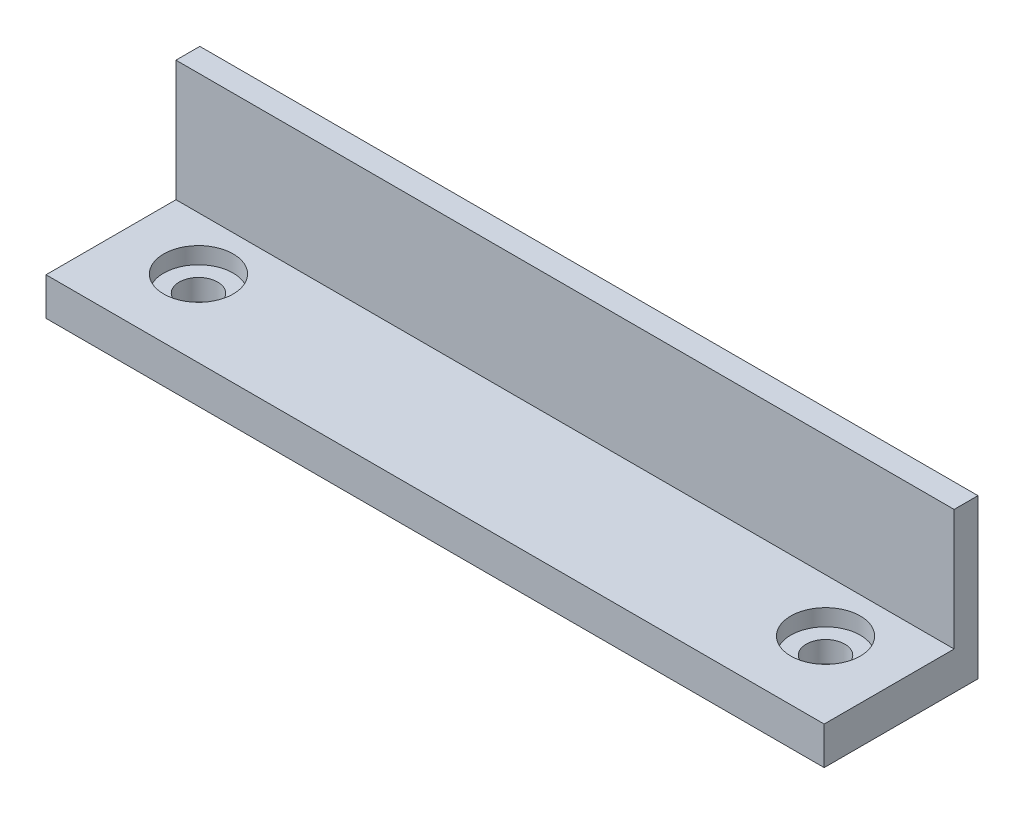
ISO-10303-21;
HEADER;
FILE_DESCRIPTION(('STEP AP214'),'2;1');
FILE_NAME('part.step','',(''),(''),'','','');
FILE_SCHEMA(('AUTOMOTIVE_DESIGN { 1 0 10303 214 1 1 1 1 }'));
ENDSEC;
DATA;
#1=APPLICATION_CONTEXT('core data for automotive mechanical design processes');
#2=APPLICATION_PROTOCOL_DEFINITION('international standard','automotive_design',2000,#1);
#3=PRODUCT_CONTEXT('',#1,'mechanical');
#4=PRODUCT('Part','Part','',(#3));
#5=PRODUCT_RELATED_PRODUCT_CATEGORY('part','',(#4));
#6=PRODUCT_DEFINITION_FORMATION('','',#4);
#7=PRODUCT_DEFINITION_CONTEXT('part definition',#1,'design');
#8=PRODUCT_DEFINITION('design','',#6,#7);
#9=PRODUCT_DEFINITION_SHAPE('','',#8);
#10=(LENGTH_UNIT() NAMED_UNIT(*) SI_UNIT(.MILLI.,.METRE.));
#11=(NAMED_UNIT(*) PLANE_ANGLE_UNIT() SI_UNIT($,.RADIAN.));
#12=(NAMED_UNIT(*) SI_UNIT($,.STERADIAN.) SOLID_ANGLE_UNIT());
#13=UNCERTAINTY_MEASURE_WITH_UNIT(LENGTH_MEASURE(1.E-05),#10,'distance_accuracy_value','');
#14=(GEOMETRIC_REPRESENTATION_CONTEXT(3) GLOBAL_UNCERTAINTY_ASSIGNED_CONTEXT((#13)) GLOBAL_UNIT_ASSIGNED_CONTEXT((#10,
#11,#12)) REPRESENTATION_CONTEXT('',''));
#15=CARTESIAN_POINT('',(0.,0.,0.));
#16=DIRECTION('',(0.,0.,1.));
#17=DIRECTION('',(1.,0.,0.));
#18=AXIS2_PLACEMENT_3D('',#15,#16,#17);
#19=CARTESIAN_POINT('',(-41.5,5.,0.));
#20=DIRECTION('',(0.,-1.,0.));
#21=DIRECTION('',(0.,0.,-1.));
#22=AXIS2_PLACEMENT_3D('',#19,#20,#21);
#23=CYLINDRICAL_SURFACE('',#22,2.55);
#24=CARTESIAN_POINT('',(-41.5,0.,0.));
#25=DIRECTION('',(0.,1.,0.));
#26=DIRECTION('',(0.,0.,1.));
#27=AXIS2_PLACEMENT_3D('',#24,#25,#26);
#28=CIRCLE('',#27,2.55);
#29=CARTESIAN_POINT('',(-41.5,0.,2.55));
#30=VERTEX_POINT('',#29);
#31=EDGE_CURVE('E118',#30,#30,#28,.F.);
#32=ORIENTED_EDGE('',*,*,#31,.T.);
#33=EDGE_LOOP('',(#32));
#34=FACE_BOUND('',#33,.T.);
#35=CARTESIAN_POINT('',(-41.5,2.8,0.));
#36=DIRECTION('',(0.,1.,0.));
#37=DIRECTION('',(0.,0.,1.));
#38=AXIS2_PLACEMENT_3D('',#35,#36,#37);
#39=CIRCLE('',#38,2.55);
#40=CARTESIAN_POINT('',(-41.5,2.8,2.55));
#41=VERTEX_POINT('',#40);
#42=EDGE_CURVE('E168',#41,#41,#39,.T.);
#43=ORIENTED_EDGE('',*,*,#42,.T.);
#44=EDGE_LOOP('',(#43));
#45=FACE_BOUND('',#44,.T.);
#46=ADVANCED_FACE('F54',(#34,#45),#23,.F.);
#47=CARTESIAN_POINT('',(41.5,5.,0.));
#48=DIRECTION('',(0.,-1.,0.));
#49=DIRECTION('',(0.,0.,-1.));
#50=AXIS2_PLACEMENT_3D('',#47,#48,#49);
#51=CYLINDRICAL_SURFACE('',#50,2.55);
#52=CARTESIAN_POINT('',(41.5,0.,0.));
#53=DIRECTION('',(0.,1.,0.));
#54=DIRECTION('',(0.,0.,1.));
#55=AXIS2_PLACEMENT_3D('',#52,#53,#54);
#56=CIRCLE('',#55,2.55);
#57=CARTESIAN_POINT('',(41.5,0.,2.55));
#58=VERTEX_POINT('',#57);
#59=EDGE_CURVE('E122',#58,#58,#56,.T.);
#60=ORIENTED_EDGE('',*,*,#59,.F.);
#61=EDGE_LOOP('',(#60));
#62=FACE_BOUND('',#61,.T.);
#63=CARTESIAN_POINT('',(41.5,2.8,0.));
#64=DIRECTION('',(0.,1.,0.));
#65=DIRECTION('',(0.,0.,1.));
#66=AXIS2_PLACEMENT_3D('',#63,#64,#65);
#67=CIRCLE('',#66,2.55);
#68=CARTESIAN_POINT('',(41.5,2.8,2.55));
#69=VERTEX_POINT('',#68);
#70=EDGE_CURVE('E165',#69,#69,#67,.T.);
#71=ORIENTED_EDGE('',*,*,#70,.T.);
#72=EDGE_LOOP('',(#71));
#73=FACE_BOUND('',#72,.T.);
#74=ADVANCED_FACE('F196',(#62,#73),#51,.F.);
#75=CARTESIAN_POINT('',(0.,5.,0.));
#76=DIRECTION('',(0.,1.,0.));
#77=DIRECTION('',(0.,0.,1.));
#78=AXIS2_PLACEMENT_3D('',#75,#76,#77);
#79=PLANE('',#78);
#80=CARTESIAN_POINT('',(-41.5,5.,0.));
#81=DIRECTION('',(0.,1.,0.));
#82=DIRECTION('',(0.,0.,1.));
#83=AXIS2_PLACEMENT_3D('',#80,#81,#82);
#84=CIRCLE('',#83,4.6);
#85=CARTESIAN_POINT('',(-41.5,5.,4.6));
#86=VERTEX_POINT('',#85);
#87=EDGE_CURVE('E171',#86,#86,#84,.T.);
#88=ORIENTED_EDGE('',*,*,#87,.F.);
#89=EDGE_LOOP('',(#88));
#90=FACE_BOUND('',#89,.T.);
#91=CARTESIAN_POINT('',(41.5,5.,0.));
#92=DIRECTION('',(0.,1.,0.));
#93=DIRECTION('',(0.,0.,1.));
#94=AXIS2_PLACEMENT_3D('',#91,#92,#93);
#95=CIRCLE('',#94,4.6);
#96=CARTESIAN_POINT('',(41.5,5.,4.6));
#97=VERTEX_POINT('',#96);
#98=EDGE_CURVE('E161',#97,#97,#95,.T.);
#99=ORIENTED_EDGE('',*,*,#98,.F.);
#100=EDGE_LOOP('',(#99));
#101=FACE_BOUND('',#100,.T.);
#102=DIRECTION('',(0.,0.,-1.));
#103=VECTOR('',#102,1.);
#104=CARTESIAN_POINT('',(51.5,5.,0.));
#105=LINE('',#104,#103);
#106=CARTESIAN_POINT('',(51.5,5.,10.18));
#107=VERTEX_POINT('',#106);
#108=CARTESIAN_POINT('',(51.5,5.,-7.02));
#109=VERTEX_POINT('',#108);
#110=EDGE_CURVE('E142',#107,#109,#105,.T.);
#111=ORIENTED_EDGE('',*,*,#110,.T.);
#112=DIRECTION('',(-1.,0.,0.));
#113=VECTOR('',#112,1.);
#114=CARTESIAN_POINT('',(0.,5.,-7.02));
#115=LINE('',#114,#113);
#116=CARTESIAN_POINT('',(-51.5,5.,-7.02));
#117=VERTEX_POINT('',#116);
#118=EDGE_CURVE('E150',#109,#117,#115,.T.);
#119=ORIENTED_EDGE('',*,*,#118,.T.);
#120=DIRECTION('',(0.,0.,-1.));
#121=VECTOR('',#120,1.);
#122=CARTESIAN_POINT('',(-51.5,5.,0.));
#123=LINE('',#122,#121);
#124=CARTESIAN_POINT('',(-51.5,5.,10.18));
#125=VERTEX_POINT('',#124);
#126=EDGE_CURVE('E103',#125,#117,#123,.T.);
#127=ORIENTED_EDGE('',*,*,#126,.F.);
#128=DIRECTION('',(1.,0.,0.));
#129=VECTOR('',#128,1.);
#130=CARTESIAN_POINT('',(0.,5.,10.18));
#131=LINE('',#130,#129);
#132=EDGE_CURVE('E100',#125,#107,#131,.T.);
#133=ORIENTED_EDGE('',*,*,#132,.T.);
#134=EDGE_LOOP('',(#111,#119,#127,#133));
#135=FACE_BOUND('',#134,.T.);
#136=ADVANCED_FACE('F193',(#90,#101,#135),#79,.T.);
#137=CARTESIAN_POINT('',(0.,5.,10.18));
#138=DIRECTION('',(0.,0.,-1.));
#139=DIRECTION('',(-1.,0.,0.));
#140=AXIS2_PLACEMENT_3D('',#137,#138,#139);
#141=PLANE('',#140);
#142=DIRECTION('',(1.,0.,0.));
#143=VECTOR('',#142,1.);
#144=CARTESIAN_POINT('',(0.,0.,10.18));
#145=LINE('',#144,#143);
#146=CARTESIAN_POINT('',(-51.5,0.,10.18));
#147=VERTEX_POINT('',#146);
#148=CARTESIAN_POINT('',(51.5,0.,10.18));
#149=VERTEX_POINT('',#148);
#150=EDGE_CURVE('E98',#147,#149,#145,.T.);
#151=ORIENTED_EDGE('',*,*,#150,.T.);
#152=DIRECTION('',(0.,-1.,0.));
#153=VECTOR('',#152,1.);
#154=CARTESIAN_POINT('',(51.5,5.,10.18));
#155=LINE('',#154,#153);
#156=EDGE_CURVE('E12',#107,#149,#155,.T.);
#157=ORIENTED_EDGE('',*,*,#156,.F.);
#158=ORIENTED_EDGE('',*,*,#132,.F.);
#159=DIRECTION('',(0.,-1.,0.));
#160=VECTOR('',#159,1.);
#161=CARTESIAN_POINT('',(-51.5,5.,10.18));
#162=LINE('',#161,#160);
#163=EDGE_CURVE('E78',#125,#147,#162,.T.);
#164=ORIENTED_EDGE('',*,*,#163,.T.);
#165=EDGE_LOOP('',(#151,#157,#158,#164));
#166=FACE_BOUND('',#165,.T.);
#167=ADVANCED_FACE('F56',(#166),#141,.F.);
#168=CARTESIAN_POINT('',(51.5,5.,0.));
#169=DIRECTION('',(-1.,0.,0.));
#170=DIRECTION('',(0.,0.,1.));
#171=AXIS2_PLACEMENT_3D('',#168,#169,#170);
#172=PLANE('',#171);
#173=DIRECTION('',(0.,0.,-1.));
#174=VECTOR('',#173,1.);
#175=CARTESIAN_POINT('',(51.5,0.,0.));
#176=LINE('',#175,#174);
#177=CARTESIAN_POINT('',(51.5,0.,-10.18));
#178=VERTEX_POINT('',#177);
#179=EDGE_CURVE('E112',#149,#178,#176,.T.);
#180=ORIENTED_EDGE('',*,*,#179,.T.);
#181=DIRECTION('',(0.,-1.,0.));
#182=VECTOR('',#181,1.);
#183=CARTESIAN_POINT('',(51.5,5.,-10.18));
#184=LINE('',#183,#182);
#185=CARTESIAN_POINT('',(51.5,21.,-10.18));
#186=VERTEX_POINT('',#185);
#187=EDGE_CURVE('E62',#186,#178,#184,.T.);
#188=ORIENTED_EDGE('',*,*,#187,.F.);
#189=DIRECTION('',(0.,0.,1.));
#190=VECTOR('',#189,1.);
#191=CARTESIAN_POINT('',(51.5,21.,0.));
#192=LINE('',#191,#190);
#193=CARTESIAN_POINT('',(51.5,21.,-7.02));
#194=VERTEX_POINT('',#193);
#195=EDGE_CURVE('E155',#186,#194,#192,.T.);
#196=ORIENTED_EDGE('',*,*,#195,.T.);
#197=DIRECTION('',(0.,-1.,0.));
#198=VECTOR('',#197,1.);
#199=CARTESIAN_POINT('',(51.5,21.,-7.02));
#200=LINE('',#199,#198);
#201=EDGE_CURVE('E147',#194,#109,#200,.T.);
#202=ORIENTED_EDGE('',*,*,#201,.T.);
#203=ORIENTED_EDGE('',*,*,#110,.F.);
#204=ORIENTED_EDGE('',*,*,#156,.T.);
#205=EDGE_LOOP('',(#180,#188,#196,#202,#203,#204));
#206=FACE_BOUND('',#205,.T.);
#207=ADVANCED_FACE('F139',(#206),#172,.F.);
#208=CARTESIAN_POINT('',(0.,5.,-10.18));
#209=DIRECTION('',(0.,0.,-1.));
#210=DIRECTION('',(-1.,0.,0.));
#211=AXIS2_PLACEMENT_3D('',#208,#209,#210);
#212=PLANE('',#211);
#213=DIRECTION('',(1.,0.,0.));
#214=VECTOR('',#213,1.);
#215=CARTESIAN_POINT('',(0.,0.,-10.18));
#216=LINE('',#215,#214);
#217=CARTESIAN_POINT('',(-51.5,0.,-10.18));
#218=VERTEX_POINT('',#217);
#219=EDGE_CURVE('E119',#218,#178,#216,.T.);
#220=ORIENTED_EDGE('',*,*,#219,.F.);
#221=DIRECTION('',(0.,-1.,0.));
#222=VECTOR('',#221,1.);
#223=CARTESIAN_POINT('',(-51.5,5.,-10.18));
#224=LINE('',#223,#222);
#225=CARTESIAN_POINT('',(-51.5,21.,-10.18));
#226=VERTEX_POINT('',#225);
#227=EDGE_CURVE('E102',#226,#218,#224,.T.);
#228=ORIENTED_EDGE('',*,*,#227,.F.);
#229=DIRECTION('',(-1.,0.,0.));
#230=VECTOR('',#229,1.);
#231=CARTESIAN_POINT('',(0.,21.,-10.18));
#232=LINE('',#231,#230);
#233=EDGE_CURVE('E135',#186,#226,#232,.T.);
#234=ORIENTED_EDGE('',*,*,#233,.F.);
#235=ORIENTED_EDGE('',*,*,#187,.T.);
#236=EDGE_LOOP('',(#220,#228,#234,#235));
#237=FACE_BOUND('',#236,.T.);
#238=ADVANCED_FACE('F132',(#237),#212,.T.);
#239=CARTESIAN_POINT('',(-51.5,5.,0.));
#240=DIRECTION('',(-1.,0.,0.));
#241=DIRECTION('',(0.,0.,1.));
#242=AXIS2_PLACEMENT_3D('',#239,#240,#241);
#243=PLANE('',#242);
#244=DIRECTION('',(0.,0.,-1.));
#245=VECTOR('',#244,1.);
#246=CARTESIAN_POINT('',(-51.5,0.,0.));
#247=LINE('',#246,#245);
#248=EDGE_CURVE('E110',#147,#218,#247,.T.);
#249=ORIENTED_EDGE('',*,*,#248,.F.);
#250=ORIENTED_EDGE('',*,*,#163,.F.);
#251=ORIENTED_EDGE('',*,*,#126,.T.);
#252=DIRECTION('',(0.,-1.,0.));
#253=VECTOR('',#252,1.);
#254=CARTESIAN_POINT('',(-51.5,21.,-7.02));
#255=LINE('',#254,#253);
#256=CARTESIAN_POINT('',(-51.5,21.,-7.02));
#257=VERTEX_POINT('',#256);
#258=EDGE_CURVE('E69',#257,#117,#255,.T.);
#259=ORIENTED_EDGE('',*,*,#258,.F.);
#260=DIRECTION('',(0.,0.,1.));
#261=VECTOR('',#260,1.);
#262=CARTESIAN_POINT('',(-51.5,21.,0.));
#263=LINE('',#262,#261);
#264=EDGE_CURVE('E152',#226,#257,#263,.T.);
#265=ORIENTED_EDGE('',*,*,#264,.F.);
#266=ORIENTED_EDGE('',*,*,#227,.T.);
#267=EDGE_LOOP('',(#249,#250,#251,#259,#265,#266));
#268=FACE_BOUND('',#267,.T.);
#269=ADVANCED_FACE('F114',(#268),#243,.T.);
#270=CARTESIAN_POINT('',(0.,0.,0.));
#271=DIRECTION('',(0.,1.,0.));
#272=DIRECTION('',(0.,0.,1.));
#273=AXIS2_PLACEMENT_3D('',#270,#271,#272);
#274=PLANE('',#273);
#275=ORIENTED_EDGE('',*,*,#150,.F.);
#276=ORIENTED_EDGE('',*,*,#248,.T.);
#277=ORIENTED_EDGE('',*,*,#219,.T.);
#278=ORIENTED_EDGE('',*,*,#179,.F.);
#279=EDGE_LOOP('',(#275,#276,#277,#278));
#280=FACE_BOUND('',#279,.T.);
#281=ORIENTED_EDGE('',*,*,#31,.F.);
#282=EDGE_LOOP('',(#281));
#283=FACE_BOUND('',#282,.T.);
#284=ORIENTED_EDGE('',*,*,#59,.T.);
#285=EDGE_LOOP('',(#284));
#286=FACE_BOUND('',#285,.T.);
#287=ADVANCED_FACE('F107',(#280,#283,#286),#274,.F.);
#288=CARTESIAN_POINT('',(0.,21.,-7.02));
#289=DIRECTION('',(0.,0.,1.));
#290=DIRECTION('',(1.,0.,0.));
#291=AXIS2_PLACEMENT_3D('',#288,#289,#290);
#292=PLANE('',#291);
#293=ORIENTED_EDGE('',*,*,#118,.F.);
#294=ORIENTED_EDGE('',*,*,#201,.F.);
#295=DIRECTION('',(-1.,0.,0.));
#296=VECTOR('',#295,1.);
#297=CARTESIAN_POINT('',(0.,21.,-7.02));
#298=LINE('',#297,#296);
#299=EDGE_CURVE('E157',#194,#257,#298,.T.);
#300=ORIENTED_EDGE('',*,*,#299,.T.);
#301=ORIENTED_EDGE('',*,*,#258,.T.);
#302=EDGE_LOOP('',(#293,#294,#300,#301));
#303=FACE_BOUND('',#302,.T.);
#304=ADVANCED_FACE('F205',(#303),#292,.T.);
#305=CARTESIAN_POINT('',(0.,21.,0.));
#306=DIRECTION('',(0.,-1.,0.));
#307=DIRECTION('',(0.,0.,-1.));
#308=AXIS2_PLACEMENT_3D('',#305,#306,#307);
#309=PLANE('',#308);
#310=ORIENTED_EDGE('',*,*,#264,.T.);
#311=ORIENTED_EDGE('',*,*,#299,.F.);
#312=ORIENTED_EDGE('',*,*,#195,.F.);
#313=ORIENTED_EDGE('',*,*,#233,.T.);
#314=EDGE_LOOP('',(#310,#311,#312,#313));
#315=FACE_BOUND('',#314,.T.);
#316=ADVANCED_FACE('F207',(#315),#309,.F.);
#317=CARTESIAN_POINT('',(41.5,2.8,0.));
#318=DIRECTION('',(0.,1.,0.));
#319=DIRECTION('',(0.,0.,1.));
#320=AXIS2_PLACEMENT_3D('',#317,#318,#319);
#321=CYLINDRICAL_SURFACE('',#320,4.6);
#322=CARTESIAN_POINT('',(41.5,2.8,0.));
#323=DIRECTION('',(0.,1.,0.));
#324=DIRECTION('',(0.,0.,1.));
#325=AXIS2_PLACEMENT_3D('',#322,#323,#324);
#326=CIRCLE('',#325,4.6);
#327=CARTESIAN_POINT('',(41.5,2.8,4.6));
#328=VERTEX_POINT('',#327);
#329=EDGE_CURVE('E164',#328,#328,#326,.T.);
#330=ORIENTED_EDGE('',*,*,#329,.F.);
#331=EDGE_LOOP('',(#330));
#332=FACE_BOUND('',#331,.T.);
#333=ORIENTED_EDGE('',*,*,#98,.T.);
#334=EDGE_LOOP('',(#333));
#335=FACE_BOUND('',#334,.T.);
#336=ADVANCED_FACE('F213',(#332,#335),#321,.F.);
#337=CARTESIAN_POINT('',(41.5,2.8,0.));
#338=DIRECTION('',(0.,1.,0.));
#339=DIRECTION('',(0.,0.,1.));
#340=AXIS2_PLACEMENT_3D('',#337,#338,#339);
#341=PLANE('',#340);
#342=ORIENTED_EDGE('',*,*,#70,.F.);
#343=EDGE_LOOP('',(#342));
#344=FACE_BOUND('',#343,.T.);
#345=ORIENTED_EDGE('',*,*,#329,.T.);
#346=EDGE_LOOP('',(#345));
#347=FACE_BOUND('',#346,.T.);
#348=ADVANCED_FACE('F189',(#344,#347),#341,.T.);
#349=CARTESIAN_POINT('',(-41.5,2.8,0.));
#350=DIRECTION('',(0.,1.,0.));
#351=DIRECTION('',(0.,0.,1.));
#352=AXIS2_PLACEMENT_3D('',#349,#350,#351);
#353=CYLINDRICAL_SURFACE('',#352,4.6);
#354=CARTESIAN_POINT('',(-41.5,2.8,0.));
#355=DIRECTION('',(0.,1.,0.));
#356=DIRECTION('',(0.,0.,1.));
#357=AXIS2_PLACEMENT_3D('',#354,#355,#356);
#358=CIRCLE('',#357,4.6);
#359=CARTESIAN_POINT('',(-41.5,2.8,4.6));
#360=VERTEX_POINT('',#359);
#361=EDGE_CURVE('E153',#360,#360,#358,.T.);
#362=ORIENTED_EDGE('',*,*,#361,.F.);
#363=EDGE_LOOP('',(#362));
#364=FACE_BOUND('',#363,.T.);
#365=ORIENTED_EDGE('',*,*,#87,.T.);
#366=EDGE_LOOP('',(#365));
#367=FACE_BOUND('',#366,.T.);
#368=ADVANCED_FACE('F183',(#364,#367),#353,.F.);
#369=CARTESIAN_POINT('',(-41.5,2.8,0.));
#370=DIRECTION('',(0.,1.,0.));
#371=DIRECTION('',(0.,0.,1.));
#372=AXIS2_PLACEMENT_3D('',#369,#370,#371);
#373=PLANE('',#372);
#374=ORIENTED_EDGE('',*,*,#42,.F.);
#375=EDGE_LOOP('',(#374));
#376=FACE_BOUND('',#375,.T.);
#377=ORIENTED_EDGE('',*,*,#361,.T.);
#378=EDGE_LOOP('',(#377));
#379=FACE_BOUND('',#378,.T.);
#380=ADVANCED_FACE('F180',(#376,#379),#373,.T.);
#381=CLOSED_SHELL('',(#46,#74,#136,#167,#207,#238,#269,#287,#304,#316,#336,#348,#368,#380));
#382=MANIFOLD_SOLID_BREP('B2',#381);
#383=ADVANCED_BREP_SHAPE_REPRESENTATION('',(#18,#382),#14);
#384=SHAPE_DEFINITION_REPRESENTATION(#9,#383);
ENDSEC;
END-ISO-10303-21;
